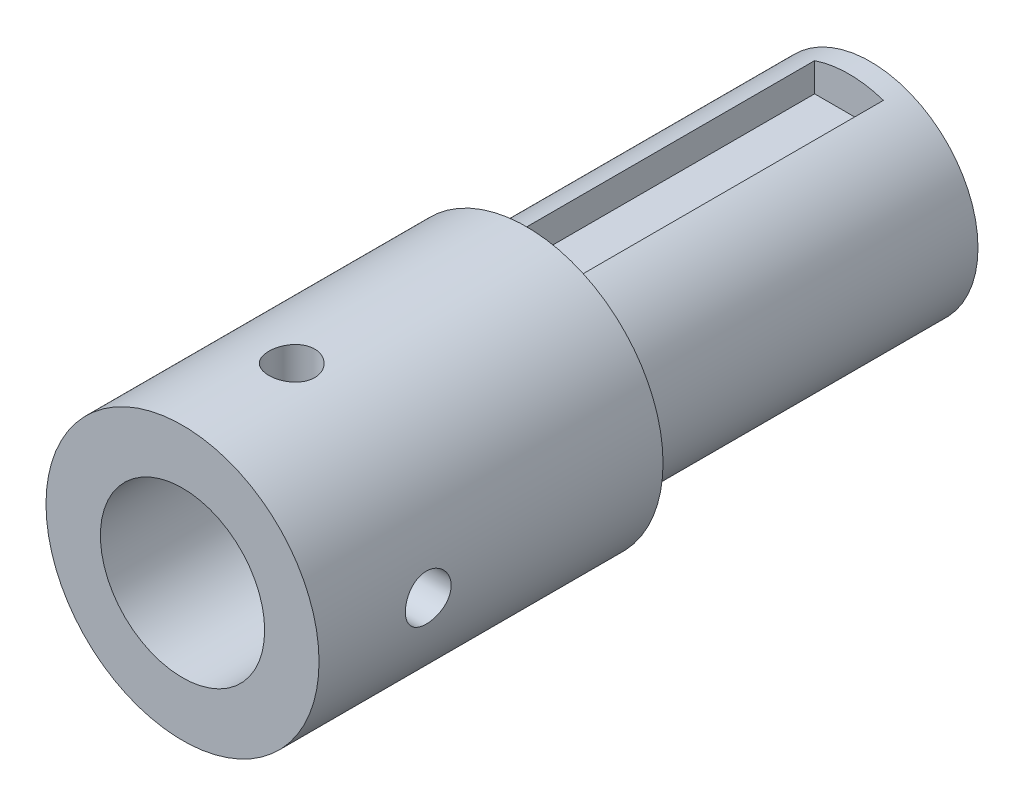
ISO-10303-21;
HEADER;
FILE_DESCRIPTION(('STEP AP214'),'2;1');
FILE_NAME('part.step','',(''),(''),'','','');
FILE_SCHEMA(('AUTOMOTIVE_DESIGN { 1 0 10303 214 1 1 1 1 }'));
ENDSEC;
DATA;
#1=APPLICATION_CONTEXT('core data for automotive mechanical design processes');
#2=APPLICATION_PROTOCOL_DEFINITION('international standard','automotive_design',2000,#1);
#3=PRODUCT_CONTEXT('',#1,'mechanical');
#4=PRODUCT('Part','Part','',(#3));
#5=PRODUCT_RELATED_PRODUCT_CATEGORY('part','',(#4));
#6=PRODUCT_DEFINITION_FORMATION('','',#4);
#7=PRODUCT_DEFINITION_CONTEXT('part definition',#1,'design');
#8=PRODUCT_DEFINITION('design','',#6,#7);
#9=PRODUCT_DEFINITION_SHAPE('','',#8);
#10=(LENGTH_UNIT() NAMED_UNIT(*) SI_UNIT(.MILLI.,.METRE.));
#11=(NAMED_UNIT(*) PLANE_ANGLE_UNIT() SI_UNIT($,.RADIAN.));
#12=(NAMED_UNIT(*) SI_UNIT($,.STERADIAN.) SOLID_ANGLE_UNIT());
#13=UNCERTAINTY_MEASURE_WITH_UNIT(LENGTH_MEASURE(1.E-05),#10,'distance_accuracy_value','');
#14=(GEOMETRIC_REPRESENTATION_CONTEXT(3) GLOBAL_UNCERTAINTY_ASSIGNED_CONTEXT((#13)) GLOBAL_UNIT_ASSIGNED_CONTEXT((#10,
#11,#12)) REPRESENTATION_CONTEXT('',''));
#15=CARTESIAN_POINT('',(0.,0.,0.));
#16=DIRECTION('',(0.,0.,1.));
#17=DIRECTION('',(1.,0.,0.));
#18=AXIS2_PLACEMENT_3D('',#15,#16,#17);
#19=CARTESIAN_POINT('',(0.,0.,80.));
#20=DIRECTION('',(0.,0.,-1.));
#21=DIRECTION('',(-1.,0.,0.));
#22=AXIS2_PLACEMENT_3D('',#19,#20,#21);
#23=CYLINDRICAL_SURFACE('',#22,15.875);
#24=CARTESIAN_POINT('',(0.,0.,80.));
#25=DIRECTION('',(0.,0.,1.));
#26=DIRECTION('',(1.,0.,0.));
#27=AXIS2_PLACEMENT_3D('',#24,#25,#26);
#28=CIRCLE('',#27,15.875);
#29=CARTESIAN_POINT('',(15.875,0.,80.));
#30=VERTEX_POINT('',#29);
#31=EDGE_CURVE('E112',#30,#30,#28,.T.);
#32=ORIENTED_EDGE('',*,*,#31,.F.);
#33=EDGE_LOOP('',(#32));
#34=FACE_BOUND('',#33,.T.);
#35=CARTESIAN_POINT('',(0.,0.,40.));
#36=DIRECTION('',(0.,0.,1.));
#37=DIRECTION('',(1.,0.,0.));
#38=AXIS2_PLACEMENT_3D('',#35,#36,#37);
#39=CIRCLE('',#38,15.875);
#40=CARTESIAN_POINT('',(15.875,0.,40.));
#41=VERTEX_POINT('',#40);
#42=EDGE_CURVE('E118',#41,#41,#39,.T.);
#43=ORIENTED_EDGE('',*,*,#42,.T.);
#44=EDGE_LOOP('',(#43));
#45=FACE_BOUND('',#44,.T.);
#46=CARTESIAN_POINT('',(0.,15.875,64.635));
#47=CARTESIAN_POINT('',(0.148574830222151,15.8749974439531,64.6350059431553));
#48=CARTESIAN_POINT('',(0.29723035095882,15.8728925068276,64.6474666324319));
#49=CARTESIAN_POINT('',(0.590370986061425,15.8646982014802,64.6969588106553));
#50=CARTESIAN_POINT('',(0.734852156314817,15.8586051859216,64.7340127920762));
#51=CARTESIAN_POINT('',(1.01536062779151,15.84311803559,64.8315403431022));
#52=CARTESIAN_POINT('',(1.15139477757379,15.8337266172861,64.8919946450501));
#53=CARTESIAN_POINT('',(1.41137166591176,15.8126748866968,65.0345560768307));
#54=CARTESIAN_POINT('',(1.53531576282232,15.8010148297419,65.1166607703272));
#55=CARTESIAN_POINT('',(1.7688127187965,15.776591735303,65.3010388334935));
#56=CARTESIAN_POINT('',(1.87823138721759,15.7638200059044,65.4034810093039));
#57=CARTESIAN_POINT('',(2.07841225181756,15.7386794367269,65.625262753193));
#58=CARTESIAN_POINT('',(2.16917326174158,15.7263106226075,65.7446033948628));
#59=CARTESIAN_POINT('',(2.33000132140763,15.7032921211663,65.9977176683239));
#60=CARTESIAN_POINT('',(2.39993546837219,15.6926536632756,66.1315768565202));
#61=CARTESIAN_POINT('',(2.51627468428092,15.6744210770315,66.4093510865808));
#62=CARTESIAN_POINT('',(2.56268136632747,15.666826739973,66.5532654382676));
#63=CARTESIAN_POINT('',(2.630225114175,15.6556288177175,66.8456416144315));
#64=CARTESIAN_POINT('',(2.65159397819609,15.6519886484727,66.9940484619561));
#65=CARTESIAN_POINT('',(2.66917424125108,15.6490005630045,67.2923824780762));
#66=CARTESIAN_POINT('',(2.66538744653968,15.649652338606,67.442309536744));
#67=CARTESIAN_POINT('',(2.63295264584047,15.6551411043839,67.7377720452682));
#68=CARTESIAN_POINT('',(2.60456520714092,15.6599342282775,67.8833370328599));
#69=CARTESIAN_POINT('',(2.52414393213176,15.673096946524,68.1676083709742));
#70=CARTESIAN_POINT('',(2.47210927406244,15.6814666651659,68.3063144829596));
#71=CARTESIAN_POINT('',(2.34560696995652,15.7008868170869,68.5737097983285));
#72=CARTESIAN_POINT('',(2.27103128709142,15.7119501095835,68.7023469181375));
#73=CARTESIAN_POINT('',(2.10164055221945,15.7355019493065,68.945380265571));
#74=CARTESIAN_POINT('',(2.00682384347064,15.7479906131616,69.0597753262588));
#75=CARTESIAN_POINT('',(1.79822367136752,15.7731786939537,69.2725854310191));
#76=CARTESIAN_POINT('',(1.68421668275045,15.7858787861973,69.370781423659));
#77=CARTESIAN_POINT('',(1.44122772574018,15.8099136117936,69.5466827915302));
#78=CARTESIAN_POINT('',(1.31224565824714,15.8212483361099,69.6243880311496));
#79=CARTESIAN_POINT('',(1.04276067034788,15.8412917573105,69.757122734755));
#80=CARTESIAN_POINT('',(0.902247947006444,15.8499981896765,69.8121326594888));
#81=CARTESIAN_POINT('',(0.613799084234204,15.8637859018818,69.8977109193133));
#82=CARTESIAN_POINT('',(0.465863576085869,15.8688674894444,69.9282813291692));
#83=CARTESIAN_POINT('',(0.168656320168709,15.8747915264858,69.9638153901519));
#84=CARTESIAN_POINT('',(0.0194214793472929,15.8756837500324,69.9690797221796));
#85=CARTESIAN_POINT('',(-0.277797762519212,15.8732649206938,69.9546540893864));
#86=CARTESIAN_POINT('',(-0.425782212174111,15.8699540319711,69.934965099178));
#87=CARTESIAN_POINT('',(-0.715369820058942,15.8595318233997,69.8714418034448));
#88=CARTESIAN_POINT('',(-0.857006589301311,15.8524439704555,69.8277565396484));
#89=CARTESIAN_POINT('',(-1.13094594421329,15.8352593974222,69.7176397766106));
#90=CARTESIAN_POINT('',(-1.26324799888907,15.8251625063381,69.6512069846599));
#91=CARTESIAN_POINT('',(-1.51606715329574,15.802956453424,69.4967935687737));
#92=CARTESIAN_POINT('',(-1.63646813448775,15.7908300846736,69.4086253477754));
#93=CARTESIAN_POINT('',(-1.86087288716593,15.7659616690858,69.2135016739276));
#94=CARTESIAN_POINT('',(-1.96487544813757,15.753219576887,69.1065448353525));
#95=CARTESIAN_POINT('',(-2.15464721018797,15.7283946539715,68.8755307782171));
#96=CARTESIAN_POINT('',(-2.24021314218652,15.7163201663211,68.7513055412446));
#97=CARTESIAN_POINT('',(-2.3892625941903,15.6943540452811,68.4900680420364));
#98=CARTESIAN_POINT('',(-2.45274682152579,15.6844623419755,68.3530561895653));
#99=CARTESIAN_POINT('',(-2.55552763689549,15.6680445249146,68.0707001992838));
#100=CARTESIAN_POINT('',(-2.59492496052652,15.6615044130697,67.9253935811734));
#101=CARTESIAN_POINT('',(-2.64873029256363,15.6524953257523,67.6301060721544));
#102=CARTESIAN_POINT('',(-2.66314050821582,15.650025990687,67.4801255953046));
#103=CARTESIAN_POINT('',(-2.66650033407667,15.6494536945559,67.1817778861848));
#104=CARTESIAN_POINT('',(-2.65576993515132,15.6512958562502,67.0334142657694));
#105=CARTESIAN_POINT('',(-2.6098455286335,15.6590186396676,66.7406355011292));
#106=CARTESIAN_POINT('',(-2.5746516036728,15.6648992477498,66.5962203435693));
#107=CARTESIAN_POINT('',(-2.48092245204504,15.680015347985,66.3155643289575));
#108=CARTESIAN_POINT('',(-2.42241516772198,15.6892468227645,66.1793139101022));
#109=CARTESIAN_POINT('',(-2.28375308906342,15.7100283339235,65.9185109682946));
#110=CARTESIAN_POINT('',(-2.20359719548095,15.7215784880304,65.7939590397872));
#111=CARTESIAN_POINT('',(-2.02277284092342,15.7458697235655,65.5584727208925));
#112=CARTESIAN_POINT('',(-1.9218691034301,15.7586234657323,65.4477202736096));
#113=CARTESIAN_POINT('',(-1.70290914420072,15.783784220492,65.2446100044426));
#114=CARTESIAN_POINT('',(-1.58484897101515,15.7961911524208,65.1522564318147));
#115=CARTESIAN_POINT('',(-1.33394237956632,15.8193613119609,64.9879724727223));
#116=CARTESIAN_POINT('',(-1.20099802378524,15.8301123954235,64.9161899356711));
#117=CARTESIAN_POINT('',(-0.924811010331563,15.8486413065397,64.7960870751381));
#118=CARTESIAN_POINT('',(-0.781578740442769,15.8564220845533,64.7477434571673));
#119=CARTESIAN_POINT('',(-0.531497548192323,15.8664418631956,64.686346724049));
#120=CARTESIAN_POINT('',(-0.426158847733916,15.8696339574882,64.6671226528847));
#121=CARTESIAN_POINT('',(-0.213894021284342,15.8739139274791,64.641447263964));
#122=CARTESIAN_POINT('',(-0.106967923295226,15.8750018402514,64.6349957211664));
#123=CARTESIAN_POINT('',(0.,15.875,64.635));
#124=B_SPLINE_CURVE_WITH_KNOTS('',3,(#46,#47,#48,#49,#50,#51,#52,#53,#54,#55,#56,#57,#58,#59,
#60,#61,#62,#63,#64,#65,#66,#67,#68,#69,#70,#71,#72,#73,#74,#75,#76,#77,#78,#79,#80,#81,#82,#83,
#84,#85,#86,#87,#88,#89,#90,#91,#92,#93,#94,#95,#96,#97,#98,#99,#100,#101,#102,#103,#104,#105,
#106,#107,#108,#109,#110,#111,#112,#113,#114,#115,#116,#117,#118,#119,#120,#121,#122,#123),
.UNSPECIFIED.,.T.,.F.,(4,2,2,2,2,2,2,2,2,2,2,2,2,2,2,2,2,2,2,2,2,2,2,2,2,2,2,2,2,2,2,2,2,2,2,2,
2,2,4),(0.,0.445333481464414,0.891074817228463,1.33644991081847,1.78177490736187,
2.23096361416013,2.68018087157159,3.13220615201705,3.58420043627532,4.03197627379662,
4.479719959965,4.92277836756543,5.36585217297634,5.81108419800178,6.25635267955829,
6.70722072776004,7.15809175981873,7.60935015776822,8.06057024256932,8.50641555691401,
8.95224345822577,9.39533311288424,9.83844795186959,10.2855300921199,10.7326452200788,
11.1844627759156,11.6362658576132,12.0861662593266,12.5360269168844,12.9801928905052,
13.4243573638498,13.8679910752357,14.3116473171559,14.7606433832668,15.2097430259913,
15.6619938475665,16.1137942790345,16.434422187209,16.7550444461398),.UNSPECIFIED.);
#125=CARTESIAN_POINT('',(0.,15.875,64.635));
#126=VERTEX_POINT('',#125);
#127=EDGE_CURVE('E305',#126,#126,#124,.T.);
#128=ORIENTED_EDGE('',*,*,#127,.T.);
#129=EDGE_LOOP('',(#128));
#130=FACE_BOUND('',#129,.T.);
#131=CARTESIAN_POINT('',(15.6497092624751,-2.66500000000005,67.3));
#132=CARTESIAN_POINT('',(15.6497119571708,-2.66499404301638,67.4485582015956));
#133=CARTESIAN_POINT('',(15.6518475202356,-2.65253604863169,67.5971971349603));
#134=CARTESIAN_POINT('',(15.6601510897537,-2.60305554541963,67.8903033178356));
#135=CARTESIAN_POINT('',(15.666322798502,-2.5660104827853,68.0347666099286));
#136=CARTESIAN_POINT('',(15.6819804009199,-2.46850901204081,68.3152372418661));
#137=CARTESIAN_POINT('',(15.6914635067756,-2.40807229237907,68.4512515816502));
#138=CARTESIAN_POINT('',(15.7126721008093,-2.2655522912443,68.7111951495746));
#139=CARTESIAN_POINT('',(15.7243973408824,-2.1834714044407,68.8351257125645));
#140=CARTESIAN_POINT('',(15.7489000614892,-1.99911761114578,69.0686374229846));
#141=CARTESIAN_POINT('',(15.7616860203353,-1.89667056137724,69.1780802163646));
#142=CARTESIAN_POINT('',(15.786794229834,-1.67486887070363,69.3783077935861));
#143=CARTESIAN_POINT('',(15.799116452811,-1.55551322271807,69.4690914652955));
#144=CARTESIAN_POINT('',(15.8219985882976,-1.30238527819934,69.6299436470995));
#145=CARTESIAN_POINT('',(15.8325473697279,-1.16853000699126,69.699883301263));
#146=CARTESIAN_POINT('',(15.8505996817842,-0.890764270243675,69.8162337722276));
#147=CARTESIAN_POINT('',(15.8581034132608,-0.746854468631905,69.8626461409312));
#148=CARTESIAN_POINT('',(15.8691603049417,-0.454494368081801,69.9302011479581));
#149=CARTESIAN_POINT('',(15.8727497923843,-0.306099189921338,69.9515762914764));
#150=CARTESIAN_POINT('',(15.8756985904821,-0.00778818106415943,69.9691731593765));
#151=CARTESIAN_POINT('',(15.8750581926598,0.142127544125889,69.9653966172046));
#152=CARTESIAN_POINT('',(15.8696481124844,0.437634126218617,69.9329784730292));
#153=CARTESIAN_POINT('',(15.8649199862695,0.583253303697431,69.9045870990316));
#154=CARTESIAN_POINT('',(15.8519120563832,0.867630972042366,69.8241393333831));
#155=CARTESIAN_POINT('',(15.8436321433124,1.00638925143763,69.7720822127954));
#156=CARTESIAN_POINT('',(15.8243802994191,1.27384944061298,69.6455325486532));
#157=CARTESIAN_POINT('',(15.8133960608374,1.40250172285567,69.5709370669722));
#158=CARTESIAN_POINT('',(15.7899556207463,1.64555708575433,69.4015036130008));
#159=CARTESIAN_POINT('',(15.777499298451,1.75995899556979,69.3066639791432));
#160=CARTESIAN_POINT('',(15.7523187254982,1.97274480536559,69.0980469963327));
#161=CARTESIAN_POINT('',(15.7395930641351,2.07091423139241,68.9840509343167));
#162=CARTESIAN_POINT('',(15.7154562556167,2.24676712645801,68.7410934930771));
#163=CARTESIAN_POINT('',(15.7040451209316,2.32445040116235,68.6121319719057));
#164=CARTESIAN_POINT('',(15.6838285790322,2.45716905811038,68.3426536595911));
#165=CARTESIAN_POINT('',(15.6750261799556,2.51217832324537,68.2021237655833));
#166=CARTESIAN_POINT('',(15.6610733222841,2.59775005488319,67.9136374198375));
#167=CARTESIAN_POINT('',(15.655922537165,2.6283147072338,67.7656816333837));
#168=CARTESIAN_POINT('',(15.6499193511508,2.66382697655991,67.4684632208698));
#169=CARTESIAN_POINT('',(15.6490156309128,2.66908046032257,67.3192381436063));
#170=CARTESIAN_POINT('',(15.6514721695124,2.65463661648683,67.0220409909722));
#171=CARTESIAN_POINT('',(15.6548322611559,2.6349402672314,66.8740688666992));
#172=CARTESIAN_POINT('',(15.6653903894307,2.5714167463799,66.5845514774096));
#173=CARTESIAN_POINT('',(15.6725636139023,2.527745520478,66.4429710111165));
#174=CARTESIAN_POINT('',(15.6899189129541,2.41767557161375,66.1691380908947));
#175=CARTESIAN_POINT('',(15.7001011698753,2.3512754712913,66.03688620286));
#176=CARTESIAN_POINT('',(15.7224463608415,2.1969117260727,65.7841040593072));
#177=CARTESIAN_POINT('',(15.7346269275857,2.10875222686801,65.6636949908051));
#178=CARTESIAN_POINT('',(15.7595448288171,1.9136407655946,65.4392698914689));
#179=CARTESIAN_POINT('',(15.7722822030081,1.80668746176245,65.3352550320881));
#180=CARTESIAN_POINT('',(15.7970410065778,1.57566867332433,65.1454526280691));
#181=CARTESIAN_POINT('',(15.8090534553385,1.45143441309544,65.0598691598409));
#182=CARTESIAN_POINT('',(15.8308644658557,1.19017379944533,64.910788980715));
#183=CARTESIAN_POINT('',(15.8406631000223,1.05314786462517,64.8472915473841));
#184=CARTESIAN_POINT('',(15.8569034292927,0.770797493828863,64.7445028066351));
#185=CARTESIAN_POINT('',(15.8633598645634,0.625512687487225,64.705105069548));
#186=CARTESIAN_POINT('',(15.8722506790193,0.330271508933731,64.6512915348312));
#187=CARTESIAN_POINT('',(15.874685394168,0.18031552800528,64.6368736504488));
#188=CARTESIAN_POINT('',(15.8752535870774,-0.118042282338005,64.6334898346141));
#189=CARTESIAN_POINT('',(15.8734395177869,-0.2664405831574,64.6442135220209));
#190=CARTESIAN_POINT('',(15.865821157741,-0.55929046974556,64.6901366388538));
#191=CARTESIAN_POINT('',(15.8600168901261,-0.703742078397314,64.7253359263386));
#192=CARTESIAN_POINT('',(15.8450681282057,-0.984477091436475,64.8190913012353));
#193=CARTESIAN_POINT('',(15.8359274616751,-1.12076964876806,64.8776206296754));
#194=CARTESIAN_POINT('',(15.8153032726352,-1.38164778508585,65.0163399540988));
#195=CARTESIAN_POINT('',(15.8038196364665,-1.50623279570145,65.09653100097));
#196=CARTESIAN_POINT('',(15.7796141915946,-1.74172194516172,65.2773960057781));
#197=CARTESIAN_POINT('',(15.7668795490481,-1.85245034402371,65.3782970870013));
#198=CARTESIAN_POINT('',(15.7416957911691,-2.05551332567914,65.5972415796857));
#199=CARTESIAN_POINT('',(15.7292467434147,-2.14784359399301,65.7152890008788));
#200=CARTESIAN_POINT('',(15.7059469605068,-2.31210006674009,65.9661833271887));
#201=CARTESIAN_POINT('',(15.6951083580456,-2.38387482637289,66.099130517786));
#202=CARTESIAN_POINT('',(15.676400170644,-2.50396238105677,66.3753230812474));
#203=CARTESIAN_POINT('',(15.6685276303117,-2.55229854424814,66.5185580329711));
#204=CARTESIAN_POINT('',(15.6583831540701,-2.61367607509781,66.7686197273362));
#205=CARTESIAN_POINT('',(15.6551485977294,-2.63289155367097,66.8739349428274));
#206=CARTESIAN_POINT('',(15.6508107018125,-2.658555541597,67.086152846006));
#207=CARTESIAN_POINT('',(15.64970732261,-2.66500428833021,67.1930555041397));
#208=CARTESIAN_POINT('',(15.6497092624751,-2.66500000000005,67.3));
#209=B_SPLINE_CURVE_WITH_KNOTS('',3,(#131,#132,#133,#134,#135,#136,#137,#138,#139,#140,#141,
#142,#143,#144,#145,#146,#147,#148,#149,#150,#151,#152,#153,#154,#155,#156,#157,#158,#159,#160,
#161,#162,#163,#164,#165,#166,#167,#168,#169,#170,#171,#172,#173,#174,#175,#176,#177,#178,#179,
#180,#181,#182,#183,#184,#185,#186,#187,#188,#189,#190,#191,#192,#193,#194,#195,#196,#197,#198,
#199,#200,#201,#202,#203,#204,#205,#206,#207,#208),.UNSPECIFIED.,.T.,.F.,(4,2,2,2,2,2,2,2,2,2,2,
2,2,2,2,2,2,2,2,2,2,2,2,2,2,2,2,2,2,2,2,2,2,2,2,2,2,2,4),(0.,0.445283512163102,
0.890976050082292,1.33629426742212,1.78156323625934,2.23081735250398,2.68009823769859,
3.13210152097907,3.58407498542243,4.03181711344872,4.47952838354593,4.92274100419118,
5.36596727730545,5.81124928309272,6.25656785008631,6.70736725381766,7.15817093374006,
7.6094924315203,8.06077356742442,8.50658738744661,8.95238372657754,9.39531414073712,
9.83827140104422,10.2853711842676,10.7325029006766,11.1843562600349,11.6361948379014,
12.0860233109713,12.5358142047135,12.9800815703492,13.4243463595681,13.8681030477475,
14.3118812680299,14.760814751839,15.2098533898506,15.6621199227663,16.1139346168041,
16.4344925239299,16.7550444706532),.UNSPECIFIED.);
#210=CARTESIAN_POINT('',(15.6497092624751,-2.66500000000005,67.3));
#211=VERTEX_POINT('',#210);
#212=EDGE_CURVE('E293',#211,#211,#209,.T.);
#213=ORIENTED_EDGE('',*,*,#212,.T.);
#214=EDGE_LOOP('',(#213));
#215=FACE_BOUND('',#214,.T.);
#216=ADVANCED_FACE('F39',(#34,#45,#130,#215),#23,.T.);
#217=CARTESIAN_POINT('',(0.,0.,54.6));
#218=DIRECTION('',(0.,0.,1.));
#219=DIRECTION('',(1.,0.,0.));
#220=AXIS2_PLACEMENT_3D('',#217,#218,#219);
#221=CYLINDRICAL_SURFACE('',#220,9.5504);
#222=CARTESIAN_POINT('',(0.,0.,54.6));
#223=DIRECTION('',(0.,0.,1.));
#224=DIRECTION('',(1.,0.,0.));
#225=AXIS2_PLACEMENT_3D('',#222,#223,#224);
#226=CIRCLE('',#225,9.5504);
#227=CARTESIAN_POINT('',(9.5504,0.,54.6));
#228=VERTEX_POINT('',#227);
#229=EDGE_CURVE('E315',#228,#228,#226,.T.);
#230=ORIENTED_EDGE('',*,*,#229,.F.);
#231=EDGE_LOOP('',(#230));
#232=FACE_BOUND('',#231,.T.);
#233=CARTESIAN_POINT('',(0.,0.,80.));
#234=DIRECTION('',(0.,0.,1.));
#235=DIRECTION('',(1.,0.,0.));
#236=AXIS2_PLACEMENT_3D('',#233,#234,#235);
#237=CIRCLE('',#236,9.5504);
#238=CARTESIAN_POINT('',(9.5504,0.,80.));
#239=VERTEX_POINT('',#238);
#240=EDGE_CURVE('E314',#239,#239,#237,.T.);
#241=ORIENTED_EDGE('',*,*,#240,.T.);
#242=EDGE_LOOP('',(#241));
#243=FACE_BOUND('',#242,.T.);
#244=CARTESIAN_POINT('',(0.,9.5504,64.635));
#245=CARTESIAN_POINT('',(-0.146657491290774,9.55039807174665,64.6350029224176));
#246=CARTESIAN_POINT('',(-0.293345431268427,9.54698894498043,64.6471464985565));
#247=CARTESIAN_POINT('',(-0.582478987055198,9.53372100661061,64.6953035395115));
#248=CARTESIAN_POINT('',(-0.724922816714093,9.52385951849873,64.7313269100024));
#249=CARTESIAN_POINT('',(-1.00135409668889,9.49877249328738,64.8259686517606));
#250=CARTESIAN_POINT('',(-1.13535273688883,9.48355423791817,64.8845563602872));
#251=CARTESIAN_POINT('',(-1.39162335762291,9.44935236575152,65.0225456204174));
#252=CARTESIAN_POINT('',(-1.5138942659349,9.43036840515579,65.1019490726528));
#253=CARTESIAN_POINT('',(-1.74631818811665,9.39014123456427,65.2814260283102));
#254=CARTESIAN_POINT('',(-1.85613382169117,9.36885657732776,65.3819271488467));
#255=CARTESIAN_POINT('',(-2.05759126240903,9.32668611646373,65.5998335048257));
#256=CARTESIAN_POINT('',(-2.14923048675092,9.30580036990047,65.7172411385367));
#257=CARTESIAN_POINT('',(-2.31342506895124,9.26636346309366,65.9683784611414));
#258=CARTESIAN_POINT('',(-2.38558385411229,9.24786432417043,66.1023763563702));
#259=CARTESIAN_POINT('',(-2.50621164508047,9.21590824430358,66.3812028917453));
#260=CARTESIAN_POINT('',(-2.55468548432105,9.20245027472954,66.526029315131));
#261=CARTESIAN_POINT('',(-2.62537953199409,9.18252966095663,66.8186458294446));
#262=CARTESIAN_POINT('',(-2.64821523514179,9.17590334401346,66.9662757976894));
#263=CARTESIAN_POINT('',(-2.66890488379704,9.16990801107857,67.2634086008379));
#264=CARTESIAN_POINT('',(-2.6667639822908,9.17053749812334,67.4129110430689));
#265=CARTESIAN_POINT('',(-2.63804795463501,9.17883666705472,67.7046705432267));
#266=CARTESIAN_POINT('',(-2.61222679397851,9.18628909808239,67.8470089860234));
#267=CARTESIAN_POINT('',(-2.53809457854499,9.20704530445239,68.125248191284));
#268=CARTESIAN_POINT('',(-2.48978157472442,9.22034958688475,68.2611483947139));
#269=CARTESIAN_POINT('',(-2.37144423936778,9.25149504966879,68.5245749961279));
#270=CARTESIAN_POINT('',(-2.30116276043055,9.26938948920415,68.6519793135617));
#271=CARTESIAN_POINT('',(-2.1410626184501,9.30767148181249,68.89344657877));
#272=CARTESIAN_POINT('',(-2.05123978387006,9.32805956680205,69.0075066699158));
#273=CARTESIAN_POINT('',(-1.85079113886003,9.36992766983759,69.2233446437933));
#274=CARTESIAN_POINT('',(-1.73953476351754,9.39142062477257,69.3245353025079));
#275=CARTESIAN_POINT('',(-1.50136635548678,9.43242384380932,69.5069490631568));
#276=CARTESIAN_POINT('',(-1.37445358457964,9.45193401434113,69.5881712230101));
#277=CARTESIAN_POINT('',(-1.10760927041599,9.4869129634682,69.7286353771772));
#278=CARTESIAN_POINT('',(-0.967614312628387,9.50236050779447,69.7877625376813));
#279=CARTESIAN_POINT('',(-0.679139768713825,9.52732056298628,69.8814682720047));
#280=CARTESIAN_POINT('',(-0.530662228299306,9.53683449829745,69.9160527379152));
#281=CARTESIAN_POINT('',(-0.234441707994666,9.54863638265264,69.9587494914917));
#282=CARTESIAN_POINT('',(-0.0868221632341917,9.55114193017481,69.9676592104542));
#283=CARTESIAN_POINT('',(0.207804968723028,9.54927491874091,69.9609675509098));
#284=CARTESIAN_POINT('',(0.354812623763838,9.54490314384888,69.9453689665254));
#285=CARTESIAN_POINT('',(0.641138137398901,9.52991401177286,69.8907545653915));
#286=CARTESIAN_POINT('',(0.780549191270947,9.51941738584396,69.8521911307422));
#287=CARTESIAN_POINT('',(1.0509040072082,9.49337672308562,69.753273801044));
#288=CARTESIAN_POINT('',(1.18184680839408,9.47783211467031,69.6929174382829));
#289=CARTESIAN_POINT('',(1.43458804890022,9.44291937444754,69.5506994433011));
#290=CARTESIAN_POINT('',(1.55613765910911,9.42347800931947,69.4684140469567));
#291=CARTESIAN_POINT('',(1.78398080241935,9.38301473428739,69.2851998815171));
#292=CARTESIAN_POINT('',(1.89027101842074,9.36199248223772,69.1842670697033));
#293=CARTESIAN_POINT('',(2.08799418937027,9.31992329952788,68.9628904170381));
#294=CARTESIAN_POINT('',(2.1788624763898,9.29889592247354,68.8419375283757));
#295=CARTESIAN_POINT('',(2.33903436877659,9.25990707618302,68.5860490516455));
#296=CARTESIAN_POINT('',(2.40833878824505,9.24194549121549,68.4511139917032));
#297=CARTESIAN_POINT('',(2.52290161573807,9.21133141476401,68.1716981274868));
#298=CARTESIAN_POINT('',(2.56829262739982,9.19864972943146,68.0272750676645));
#299=CARTESIAN_POINT('',(2.63401385335959,9.18004902502953,67.7324263112523));
#300=CARTESIAN_POINT('',(2.65435122784907,9.17412807381499,67.5820023423829));
#301=CARTESIAN_POINT('',(2.66894802136518,9.16989128603654,67.2852321015689));
#302=CARTESIAN_POINT('',(2.66411937557327,9.17130948880444,67.1389338410554));
#303=CARTESIAN_POINT('',(2.63065862723117,9.18096248339046,66.8493260988888));
#304=CARTESIAN_POINT('',(2.60202725164113,9.18919706702919,66.7060165260951));
#305=CARTESIAN_POINT('',(2.52232501687129,9.21138920106366,66.4277244603197));
#306=CARTESIAN_POINT('',(2.47146469264941,9.22529297644307,66.2926770753656));
#307=CARTESIAN_POINT('',(2.34891111445644,9.25725386455716,66.0329269430123));
#308=CARTESIAN_POINT('',(2.27721431810645,9.27531168340593,65.908225959228));
#309=CARTESIAN_POINT('',(2.1123324548675,9.31426726834532,65.6683984313418));
#310=CARTESIAN_POINT('',(2.01853343671725,9.33523739603763,65.5537056973595));
#311=CARTESIAN_POINT('',(1.81325481742236,9.3772707043213,65.3413923095923));
#312=CARTESIAN_POINT('',(1.70177082849652,9.39833390674111,65.243775905252));
#313=CARTESIAN_POINT('',(1.46104689035348,9.43878774643714,65.0660613248661));
#314=CARTESIAN_POINT('',(1.33144380352456,9.45812584768994,64.9864419808375));
#315=CARTESIAN_POINT('',(1.0601534098734,9.49235761540703,64.8502437530395));
#316=CARTESIAN_POINT('',(0.918473181851539,9.50725386266324,64.7936514831565));
#317=CARTESIAN_POINT('',(0.647964474926122,9.52921801898741,64.7116805304371));
#318=CARTESIAN_POINT('',(0.520194689181498,9.53710067345117,64.682995954233));
#319=CARTESIAN_POINT('',(0.261624434098723,9.5476922125191,64.6446555311516));
#320=CARTESIAN_POINT('',(0.130824331594657,9.5504017200789,64.634997393087));
#321=CARTESIAN_POINT('',(0.,9.5504,64.635));
#322=B_SPLINE_CURVE_WITH_KNOTS('',3,(#244,#245,#246,#247,#248,#249,#250,#251,#252,#253,#254,
#255,#256,#257,#258,#259,#260,#261,#262,#263,#264,#265,#266,#267,#268,#269,#270,#271,#272,#273,
#274,#275,#276,#277,#278,#279,#280,#281,#282,#283,#284,#285,#286,#287,#288,#289,#290,#291,#292,
#293,#294,#295,#296,#297,#298,#299,#300,#301,#302,#303,#304,#305,#306,#307,#308,#309,#310,#311,
#312,#313,#314,#315,#316,#317,#318,#319,#320,#321),.UNSPECIFIED.,.T.,.F.,(4,2,2,2,2,2,2,2,2,2,2,
2,2,2,2,2,2,2,2,2,2,2,2,2,2,2,2,2,2,2,2,2,2,2,2,2,2,2,4),(0.,0.439492430981163,
0.879167283785225,1.31824675740513,1.75736633621183,2.206436505894,2.65557044116665,
3.11325578074302,3.57084768052283,4.01720218415044,4.46346460088508,4.89599375351174,
5.32856039417833,5.76639297448476,6.2043191117613,6.65795162658986,7.11160553894697,
7.56758546386644,8.02345588226624,8.46500627017713,8.90650632182752,9.3395843415157,
9.77271141597785,10.2149060957924,10.657196755179,11.1132385778148,11.5692631814035,
12.0227317080525,12.4760706058064,12.9130987696145,13.350113586618,13.7830761239548,
14.2161123117376,14.6629991013878,15.1099969411033,15.5677663452322,16.0252692570539,
16.4173612535295,16.8094060309082),.UNSPECIFIED.);
#323=CARTESIAN_POINT('',(0.,9.5504,64.635));
#324=VERTEX_POINT('',#323);
#325=EDGE_CURVE('E299',#324,#324,#322,.T.);
#326=ORIENTED_EDGE('',*,*,#325,.T.);
#327=EDGE_LOOP('',(#326));
#328=FACE_BOUND('',#327,.T.);
#329=CARTESIAN_POINT('',(9.17103675491489,-2.66500000000003,67.3));
#330=CARTESIAN_POINT('',(9.17103900370719,-2.66499702340668,67.1534679287744));
#331=CARTESIAN_POINT('',(9.17458703526676,-2.65287348513885,67.0069053145383));
#332=CARTESIAN_POINT('',(9.18834835356126,-2.60480323829726,66.7180315520369));
#333=CARTESIAN_POINT('',(9.19856457497838,-2.56884604037942,66.5757223045379));
#334=CARTESIAN_POINT('',(9.22441710757966,-2.47439762089914,66.2995767324309));
#335=CARTESIAN_POINT('',(9.24004529984989,-2.41594013918182,66.1657280691347));
#336=CARTESIAN_POINT('',(9.2749503004839,-2.27825825446927,65.9097122775702));
#337=CARTESIAN_POINT('',(9.29422748933703,-2.19903168550112,65.7875463694913));
#338=CARTESIAN_POINT('',(9.33485011778516,-2.0197397173603,65.5550189552903));
#339=CARTESIAN_POINT('',(9.356234954659,-1.91920683690689,65.4450247077652));
#340=CARTESIAN_POINT('',(9.39832458610593,-1.70116014315349,65.2432182790261));
#341=CARTESIAN_POINT('',(9.41902930418224,-1.583644427671,65.1514081372787));
#342=CARTESIAN_POINT('',(9.45786831450517,-1.33239757705772,64.9870219969194));
#343=CARTESIAN_POINT('',(9.47595073173065,-1.19841664019551,64.9148144700302));
#344=CARTESIAN_POINT('',(9.50705366839504,-0.91962599435956,64.7940920527957));
#345=CARTESIAN_POINT('',(9.52007512582479,-0.774818297939337,64.7455727716784));
#346=CARTESIAN_POINT('',(9.53931034036591,-0.482321440459569,64.6748023233966));
#347=CARTESIAN_POINT('',(9.5456859300659,-0.33479445686877,64.6519256357451));
#348=CARTESIAN_POINT('',(9.55147834600738,-0.0378679354955591,64.6311182101693));
#349=CARTESIAN_POINT('',(9.55089644324782,0.111531255289595,64.633182915937));
#350=CARTESIAN_POINT('',(9.54295652079681,0.403595142668218,64.6617665495483));
#351=CARTESIAN_POINT('',(9.535785922845,0.546331914377162,64.6876091209052));
#352=CARTESIAN_POINT('',(9.51569781641932,0.825356088185962,64.7619178887578));
#353=CARTESIAN_POINT('',(9.50277996559469,0.961643105553507,64.8103854329801));
#354=CARTESIAN_POINT('',(9.47237762815916,1.22558282187627,64.9290646852998));
#355=CARTESIAN_POINT('',(9.45484622884639,1.35312879708002,64.9995012321271));
#356=CARTESIAN_POINT('',(9.41709540155843,1.59481620764664,65.1599447198804));
#357=CARTESIAN_POINT('',(9.3968754077084,1.70895481157727,65.2499557832426));
#358=CARTESIAN_POINT('',(9.35512900112613,1.92462544322662,65.4505547798654));
#359=CARTESIAN_POINT('',(9.33358151661232,2.02560649383227,65.5617314288245));
#360=CARTESIAN_POINT('',(9.29221356418675,2.20763319405679,65.7996605762168));
#361=CARTESIAN_POINT('',(9.27239322339471,2.28867737709858,65.9264142194822));
#362=CARTESIAN_POINT('',(9.23663294347055,2.42900336967659,66.1931847113506));
#363=CARTESIAN_POINT('',(9.22072241746965,2.48812183010574,66.3332917086775));
#364=CARTESIAN_POINT('',(9.19494159367521,2.58177755050147,66.6220137061287));
#365=CARTESIAN_POINT('',(9.18506963247888,2.61632158024878,66.7706263509131));
#366=CARTESIAN_POINT('',(9.17284197754813,2.65886962516117,67.0669550617208));
#367=CARTESIAN_POINT('',(9.17025201476396,2.66770117951685,67.214542761505));
#368=CARTESIAN_POINT('',(9.17223814967513,2.66086478208704,67.5090889256264));
#369=CARTESIAN_POINT('',(9.17681340118924,2.64519972324734,67.65604746221));
#370=CARTESIAN_POINT('',(9.19238681548986,2.59054714893967,67.941882559214));
#371=CARTESIAN_POINT('',(9.20324440892613,2.55206961914933,68.0808650464529));
#372=CARTESIAN_POINT('',(9.23001880526816,2.45346411240257,68.3504001075854));
#373=CARTESIAN_POINT('',(9.24593631400931,2.39333311472939,68.480951502321));
#374=CARTESIAN_POINT('',(9.28150828631111,2.25148757286604,68.7333461890466));
#375=CARTESIAN_POINT('',(9.30124258296528,2.1692939671183,68.8549087298394));
#376=CARTESIAN_POINT('',(9.34204276913994,1.98624112667328,69.0828192530352));
#377=CARTESIAN_POINT('',(9.36310893300069,1.88537803810261,69.189164086051));
#378=CARTESIAN_POINT('',(9.40501552615037,1.66399880183769,69.3871213056171));
#379=CARTESIAN_POINT('',(9.42582713994845,1.54295687044716,69.4781530799322));
#380=CARTESIAN_POINT('',(9.46419236625262,1.2868352953896,69.6386130529092));
#381=CARTESIAN_POINT('',(9.48174615109704,1.15175639486476,69.7080423944658));
#382=CARTESIAN_POINT('',(9.51150513352923,0.872340383772907,69.8226709096778));
#383=CARTESIAN_POINT('',(9.5237506328852,0.728082924109475,69.8680532616491));
#384=CARTESIAN_POINT('',(9.54169115268415,0.43359266647617,69.9338127332066));
#385=CARTESIAN_POINT('',(9.54738777407568,0.283361338182015,69.9541959641971));
#386=CARTESIAN_POINT('',(9.55150516707407,-0.0134098743485666,69.9689658218647));
#387=CARTESIAN_POINT('',(9.55016327853216,-0.159904832325896,69.9642004308265));
#388=CARTESIAN_POINT('',(9.54089929653077,-0.449923336628771,69.9307981153976));
#389=CARTESIAN_POINT('',(9.53297749318582,-0.593447013674899,69.9021622434784));
#390=CARTESIAN_POINT('',(9.51149858766298,-0.872326647929218,69.8223288408737));
#391=CARTESIAN_POINT('',(9.49798809700431,-1.00773979813352,69.7713177195614));
#392=CARTESIAN_POINT('',(9.46673796692566,-1.26816133549486,69.6483476248831));
#393=CARTESIAN_POINT('',(9.44899769345067,-1.39316815892355,69.576385510553));
#394=CARTESIAN_POINT('',(9.41054026309897,-1.63311691199079,69.4111554437115));
#395=CARTESIAN_POINT('',(9.38975234857999,-1.74766759668706,69.3173358705182));
#396=CARTESIAN_POINT('',(9.34780605482786,-1.95968533128415,69.1120810917516));
#397=CARTESIAN_POINT('',(9.3266475764879,-2.05714773176728,69.0006411076151));
#398=CARTESIAN_POINT('',(9.28574862954118,-2.2346204369854,68.7599979361166));
#399=CARTESIAN_POINT('',(9.26605612766233,-2.31413991301377,68.6304238203232));
#400=CARTESIAN_POINT('',(9.23102527410295,-2.45015858896943,68.3592120962496));
#401=CARTESIAN_POINT('',(9.21568433734571,-2.50667146484428,68.2175817153691));
#402=CARTESIAN_POINT('',(9.19300824649068,-2.58848735449143,67.947260151293));
#403=CARTESIAN_POINT('',(9.18483945373982,-2.61710822408671,67.8196341769238));
#404=CARTESIAN_POINT('',(9.17385308228569,-2.65536453616393,67.5613466127354));
#405=CARTESIAN_POINT('',(9.17103474931681,-2.66500265469158,67.4306854534218));
#406=CARTESIAN_POINT('',(9.17103675491489,-2.66500000000003,67.3));
#407=B_SPLINE_CURVE_WITH_KNOTS('',3,(#329,#330,#331,#332,#333,#334,#335,#336,#337,#338,#339,
#340,#341,#342,#343,#344,#345,#346,#347,#348,#349,#350,#351,#352,#353,#354,#355,#356,#357,#358,
#359,#360,#361,#362,#363,#364,#365,#366,#367,#368,#369,#370,#371,#372,#373,#374,#375,#376,#377,
#378,#379,#380,#381,#382,#383,#384,#385,#386,#387,#388,#389,#390,#391,#392,#393,#394,#395,#396,
#397,#398,#399,#400,#401,#402,#403,#404,#405,#406),.UNSPECIFIED.,.T.,.F.,(4,2,2,2,2,2,2,2,2,2,2,
2,2,2,2,2,2,2,2,2,2,2,2,2,2,2,2,2,2,2,2,2,2,2,2,2,2,2,4),(0.,0.439115135270044,
0.878423656315776,1.31707597158175,1.75577405136588,2.20533642994751,2.65494920137687,
3.11250540303726,3.56997676141956,4.0160277938891,4.46199734273075,4.89566090665611,
5.32935030639133,5.76763255175946,6.20600718987558,6.6590796001519,7.11218532895464,
7.56860198647552,8.0248928612875,8.46632656158038,8.90770813436841,9.33957587713901,
9.77150388997051,10.2136987266253,10.6559849459563,11.1124300087454,11.5688509188181,
12.0217431488425,12.4745246405925,12.9121384832393,13.3497330321102,13.7837492183502,
14.2178305056513,14.6643552085811,15.1110012150297,15.5686854173262,16.0260971570732,
16.4177796852656,16.8094069930429),.UNSPECIFIED.);
#408=CARTESIAN_POINT('',(9.17103675491489,-2.66500000000003,67.3));
#409=VERTEX_POINT('',#408);
#410=EDGE_CURVE('E289',#409,#409,#407,.T.);
#411=ORIENTED_EDGE('',*,*,#410,.T.);
#412=EDGE_LOOP('',(#411));
#413=FACE_BOUND('',#412,.T.);
#414=ADVANCED_FACE('F162',(#232,#243,#328,#413),#221,.F.);
#415=CARTESIAN_POINT('',(0.,0.,40.));
#416=DIRECTION('',(0.,0.,-1.));
#417=DIRECTION('',(-1.,0.,0.));
#418=AXIS2_PLACEMENT_3D('',#415,#416,#417);
#419=CYLINDRICAL_SURFACE('',#418,12.5);
#420=DIRECTION('',(0.,0.,-1.));
#421=VECTOR('',#420,1.);
#422=CARTESIAN_POINT('',(4.,11.842719282327,40.));
#423=LINE('',#422,#421);
#424=CARTESIAN_POINT('',(4.,11.842719282327,2.5));
#425=VERTEX_POINT('',#424);
#426=CARTESIAN_POINT('',(4.,11.842719282327,37.5));
#427=VERTEX_POINT('',#426);
#428=EDGE_CURVE('E11',#425,#427,#423,.F.);
#429=ORIENTED_EDGE('',*,*,#428,.T.);
#430=CARTESIAN_POINT('',(0.,0.,37.5));
#431=DIRECTION('',(0.,0.,1.));
#432=DIRECTION('',(1.,0.,0.));
#433=AXIS2_PLACEMENT_3D('',#430,#431,#432);
#434=CIRCLE('',#433,12.5);
#435=CARTESIAN_POINT('',(-4.,11.842719282327,37.5));
#436=VERTEX_POINT('',#435);
#437=EDGE_CURVE('E139',#427,#436,#434,.T.);
#438=ORIENTED_EDGE('',*,*,#437,.T.);
#439=DIRECTION('',(0.,0.,-1.));
#440=VECTOR('',#439,1.);
#441=CARTESIAN_POINT('',(-4.,11.842719282327,40.));
#442=LINE('',#441,#440);
#443=CARTESIAN_POINT('',(-4.,11.842719282327,2.5));
#444=VERTEX_POINT('',#443);
#445=EDGE_CURVE('E48',#436,#444,#442,.T.);
#446=ORIENTED_EDGE('',*,*,#445,.T.);
#447=CARTESIAN_POINT('',(0.,0.,2.5));
#448=DIRECTION('',(0.,0.,-1.));
#449=DIRECTION('',(-1.,0.,0.));
#450=AXIS2_PLACEMENT_3D('',#447,#448,#449);
#451=CIRCLE('',#450,12.5);
#452=EDGE_CURVE('E69',#444,#425,#451,.T.);
#453=ORIENTED_EDGE('',*,*,#452,.T.);
#454=EDGE_LOOP('',(#429,#438,#446,#453));
#455=FACE_BOUND('',#454,.T.);
#456=CARTESIAN_POINT('',(0.,0.,40.));
#457=DIRECTION('',(0.,0.,1.));
#458=DIRECTION('',(1.,0.,0.));
#459=AXIS2_PLACEMENT_3D('',#456,#457,#458);
#460=CIRCLE('',#459,12.5);
#461=CARTESIAN_POINT('',(12.5,0.,40.));
#462=VERTEX_POINT('',#461);
#463=EDGE_CURVE('E135',#462,#462,#460,.T.);
#464=ORIENTED_EDGE('',*,*,#463,.F.);
#465=EDGE_LOOP('',(#464));
#466=FACE_BOUND('',#465,.T.);
#467=CARTESIAN_POINT('',(0.,0.,0.));
#468=DIRECTION('',(0.,0.,1.));
#469=DIRECTION('',(1.,0.,0.));
#470=AXIS2_PLACEMENT_3D('',#467,#468,#469);
#471=CIRCLE('',#470,12.5);
#472=CARTESIAN_POINT('',(12.5,0.,0.));
#473=VERTEX_POINT('',#472);
#474=EDGE_CURVE('E129',#473,#473,#471,.T.);
#475=ORIENTED_EDGE('',*,*,#474,.T.);
#476=EDGE_LOOP('',(#475));
#477=FACE_BOUND('',#476,.T.);
#478=ADVANCED_FACE('F41',(#455,#466,#477),#419,.T.);
#479=CARTESIAN_POINT('',(0.,0.,0.));
#480=DIRECTION('',(0.,0.,1.));
#481=DIRECTION('',(1.,0.,0.));
#482=AXIS2_PLACEMENT_3D('',#479,#480,#481);
#483=PLANE('',#482);
#484=ORIENTED_EDGE('',*,*,#474,.F.);
#485=EDGE_LOOP('',(#484));
#486=FACE_BOUND('',#485,.T.);
#487=ADVANCED_FACE('F158',(#486),#483,.F.);
#488=CARTESIAN_POINT('',(-4.,8.5,37.5));
#489=DIRECTION('',(-1.,0.,0.));
#490=DIRECTION('',(0.,0.,1.));
#491=AXIS2_PLACEMENT_3D('',#488,#489,#490);
#492=PLANE('',#491);
#493=DIRECTION('',(0.,1.,0.));
#494=VECTOR('',#493,1.);
#495=CARTESIAN_POINT('',(-4.,8.5,37.5));
#496=LINE('',#495,#494);
#497=CARTESIAN_POINT('',(-4.,8.5,37.5));
#498=VERTEX_POINT('',#497);
#499=EDGE_CURVE('E58',#498,#436,#496,.T.);
#500=ORIENTED_EDGE('',*,*,#499,.F.);
#501=DIRECTION('',(0.,0.,1.));
#502=VECTOR('',#501,1.);
#503=CARTESIAN_POINT('',(-4.,8.5,37.5));
#504=LINE('',#503,#502);
#505=CARTESIAN_POINT('',(-4.,8.5,2.5));
#506=VERTEX_POINT('',#505);
#507=EDGE_CURVE('E91',#506,#498,#504,.T.);
#508=ORIENTED_EDGE('',*,*,#507,.F.);
#509=DIRECTION('',(0.,1.,0.));
#510=VECTOR('',#509,1.);
#511=CARTESIAN_POINT('',(-4.,8.5,2.5));
#512=LINE('',#511,#510);
#513=EDGE_CURVE('E126',#506,#444,#512,.T.);
#514=ORIENTED_EDGE('',*,*,#513,.T.);
#515=ORIENTED_EDGE('',*,*,#445,.F.);
#516=EDGE_LOOP('',(#500,#508,#514,#515));
#517=FACE_BOUND('',#516,.T.);
#518=ADVANCED_FACE('F89',(#517),#492,.F.);
#519=CARTESIAN_POINT('',(4.,8.5,2.5));
#520=DIRECTION('',(0.,0.,-1.));
#521=DIRECTION('',(-1.,0.,0.));
#522=AXIS2_PLACEMENT_3D('',#519,#520,#521);
#523=PLANE('',#522);
#524=ORIENTED_EDGE('',*,*,#513,.F.);
#525=DIRECTION('',(-1.,0.,0.));
#526=VECTOR('',#525,1.);
#527=CARTESIAN_POINT('',(4.,8.5,2.5));
#528=LINE('',#527,#526);
#529=CARTESIAN_POINT('',(4.,8.5,2.5));
#530=VERTEX_POINT('',#529);
#531=EDGE_CURVE('E97',#530,#506,#528,.T.);
#532=ORIENTED_EDGE('',*,*,#531,.F.);
#533=DIRECTION('',(0.,1.,0.));
#534=VECTOR('',#533,1.);
#535=CARTESIAN_POINT('',(4.,8.5,2.5));
#536=LINE('',#535,#534);
#537=EDGE_CURVE('E130',#530,#425,#536,.T.);
#538=ORIENTED_EDGE('',*,*,#537,.T.);
#539=ORIENTED_EDGE('',*,*,#452,.F.);
#540=EDGE_LOOP('',(#524,#532,#538,#539));
#541=FACE_BOUND('',#540,.T.);
#542=ADVANCED_FACE('F150',(#541),#523,.F.);
#543=CARTESIAN_POINT('',(4.,8.5,37.5));
#544=DIRECTION('',(1.,0.,0.));
#545=DIRECTION('',(0.,0.,-1.));
#546=AXIS2_PLACEMENT_3D('',#543,#544,#545);
#547=PLANE('',#546);
#548=ORIENTED_EDGE('',*,*,#537,.F.);
#549=DIRECTION('',(0.,0.,-1.));
#550=VECTOR('',#549,1.);
#551=CARTESIAN_POINT('',(4.,8.5,37.5));
#552=LINE('',#551,#550);
#553=CARTESIAN_POINT('',(4.,8.5,37.5));
#554=VERTEX_POINT('',#553);
#555=EDGE_CURVE('E107',#554,#530,#552,.T.);
#556=ORIENTED_EDGE('',*,*,#555,.F.);
#557=DIRECTION('',(0.,1.,0.));
#558=VECTOR('',#557,1.);
#559=CARTESIAN_POINT('',(4.,8.5,37.5));
#560=LINE('',#559,#558);
#561=EDGE_CURVE('E96',#554,#427,#560,.T.);
#562=ORIENTED_EDGE('',*,*,#561,.T.);
#563=ORIENTED_EDGE('',*,*,#428,.F.);
#564=EDGE_LOOP('',(#548,#556,#562,#563));
#565=FACE_BOUND('',#564,.T.);
#566=ADVANCED_FACE('F149',(#565),#547,.F.);
#567=CARTESIAN_POINT('',(4.,8.5,37.5));
#568=DIRECTION('',(0.,0.,1.));
#569=DIRECTION('',(1.,0.,0.));
#570=AXIS2_PLACEMENT_3D('',#567,#568,#569);
#571=PLANE('',#570);
#572=ORIENTED_EDGE('',*,*,#561,.F.);
#573=DIRECTION('',(1.,0.,0.));
#574=VECTOR('',#573,1.);
#575=CARTESIAN_POINT('',(4.,8.5,37.5));
#576=LINE('',#575,#574);
#577=EDGE_CURVE('E100',#498,#554,#576,.T.);
#578=ORIENTED_EDGE('',*,*,#577,.F.);
#579=ORIENTED_EDGE('',*,*,#499,.T.);
#580=ORIENTED_EDGE('',*,*,#437,.F.);
#581=EDGE_LOOP('',(#572,#578,#579,#580));
#582=FACE_BOUND('',#581,.T.);
#583=ADVANCED_FACE('F101',(#582),#571,.F.);
#584=CARTESIAN_POINT('',(0.,8.5,0.));
#585=DIRECTION('',(0.,1.,0.));
#586=DIRECTION('',(0.,0.,1.));
#587=AXIS2_PLACEMENT_3D('',#584,#585,#586);
#588=PLANE('',#587);
#589=ORIENTED_EDGE('',*,*,#507,.T.);
#590=ORIENTED_EDGE('',*,*,#577,.T.);
#591=ORIENTED_EDGE('',*,*,#555,.T.);
#592=ORIENTED_EDGE('',*,*,#531,.T.);
#593=EDGE_LOOP('',(#589,#590,#591,#592));
#594=FACE_BOUND('',#593,.T.);
#595=ADVANCED_FACE('F109',(#594),#588,.T.);
#596=CARTESIAN_POINT('',(0.,0.,80.));
#597=DIRECTION('',(0.,0.,1.));
#598=DIRECTION('',(1.,0.,0.));
#599=AXIS2_PLACEMENT_3D('',#596,#597,#598);
#600=PLANE('',#599);
#601=ORIENTED_EDGE('',*,*,#240,.F.);
#602=EDGE_LOOP('',(#601));
#603=FACE_BOUND('',#602,.T.);
#604=ORIENTED_EDGE('',*,*,#31,.T.);
#605=EDGE_LOOP('',(#604));
#606=FACE_BOUND('',#605,.T.);
#607=ADVANCED_FACE('F175',(#603,#606),#600,.T.);
#608=CARTESIAN_POINT('',(0.,0.,40.));
#609=DIRECTION('',(0.,0.,1.));
#610=DIRECTION('',(1.,0.,0.));
#611=AXIS2_PLACEMENT_3D('',#608,#609,#610);
#612=PLANE('',#611);
#613=ORIENTED_EDGE('',*,*,#463,.T.);
#614=EDGE_LOOP('',(#613));
#615=FACE_BOUND('',#614,.T.);
#616=ORIENTED_EDGE('',*,*,#42,.F.);
#617=EDGE_LOOP('',(#616));
#618=FACE_BOUND('',#617,.T.);
#619=ADVANCED_FACE('F172',(#615,#618),#612,.F.);
#620=CARTESIAN_POINT('',(0.,0.,54.6));
#621=DIRECTION('',(0.,0.,1.));
#622=DIRECTION('',(1.,0.,0.));
#623=AXIS2_PLACEMENT_3D('',#620,#621,#622);
#624=PLANE('',#623);
#625=ORIENTED_EDGE('',*,*,#229,.T.);
#626=EDGE_LOOP('',(#625));
#627=FACE_BOUND('',#626,.T.);
#628=ADVANCED_FACE('F227',(#627),#624,.T.);
#629=CARTESIAN_POINT('',(0.,15.876,67.3));
#630=DIRECTION('',(0.,-1.,0.));
#631=DIRECTION('',(0.,0.,-1.));
#632=AXIS2_PLACEMENT_3D('',#629,#630,#631);
#633=CYLINDRICAL_SURFACE('',#632,2.665);
#634=ORIENTED_EDGE('',*,*,#325,.F.);
#635=EDGE_LOOP('',(#634));
#636=FACE_BOUND('',#635,.T.);
#637=ORIENTED_EDGE('',*,*,#127,.F.);
#638=EDGE_LOOP('',(#637));
#639=FACE_BOUND('',#638,.T.);
#640=ADVANCED_FACE('F241',(#636,#639),#633,.F.);
#641=CARTESIAN_POINT('',(15.8760000000001,0.,67.3));
#642=DIRECTION('',(-1.,0.,0.));
#643=DIRECTION('',(0.,-1.,0.));
#644=AXIS2_PLACEMENT_3D('',#641,#642,#643);
#645=CYLINDRICAL_SURFACE('',#644,2.665);
#646=ORIENTED_EDGE('',*,*,#410,.F.);
#647=EDGE_LOOP('',(#646));
#648=FACE_BOUND('',#647,.T.);
#649=ORIENTED_EDGE('',*,*,#212,.F.);
#650=EDGE_LOOP('',(#649));
#651=FACE_BOUND('',#650,.T.);
#652=ADVANCED_FACE('F251',(#648,#651),#645,.F.);
#653=CLOSED_SHELL('',(#216,#414,#478,#487,#518,#542,#566,#583,#595,#607,#619,#628,#640,#652));
#654=MANIFOLD_SOLID_BREP('B2',#653);
#655=ADVANCED_BREP_SHAPE_REPRESENTATION('',(#18,#654),#14);
#656=SHAPE_DEFINITION_REPRESENTATION(#9,#655);
ENDSEC;
END-ISO-10303-21;
